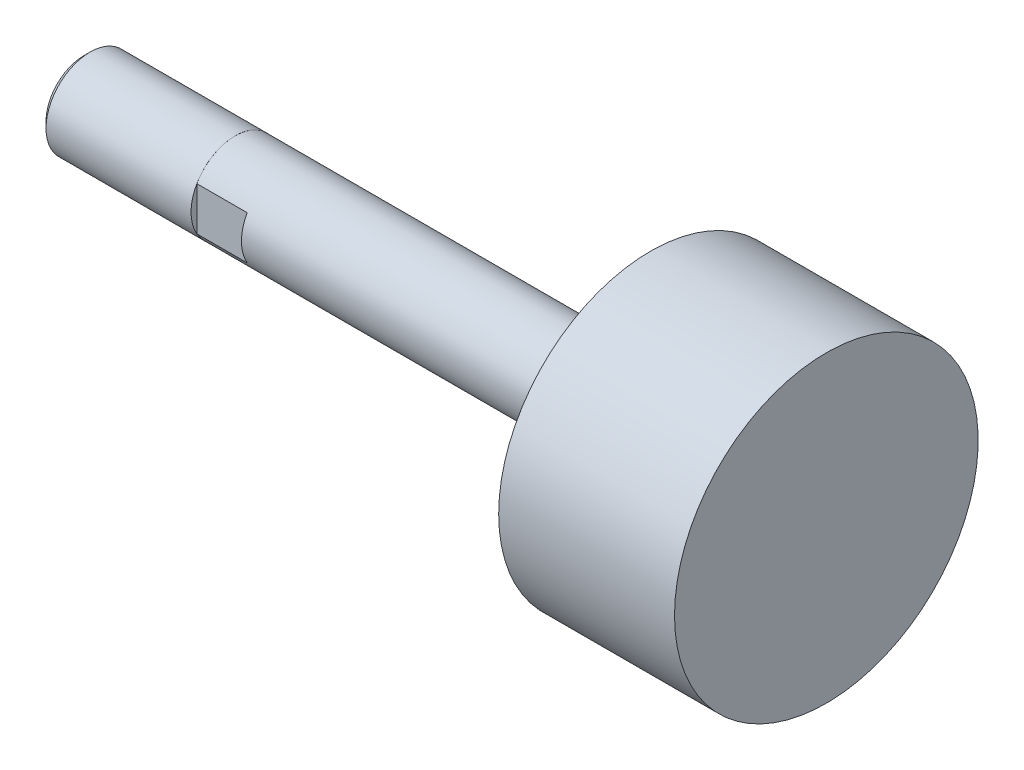
ISO-10303-21;
HEADER;
FILE_DESCRIPTION(('STEP AP214'),'2;1');
FILE_NAME('part.step','',(''),(''),'','','');
FILE_SCHEMA(('AUTOMOTIVE_DESIGN { 1 0 10303 214 1 1 1 1 }'));
ENDSEC;
DATA;
#1=APPLICATION_CONTEXT('core data for automotive mechanical design processes');
#2=APPLICATION_PROTOCOL_DEFINITION('international standard','automotive_design',2000,#1);
#3=PRODUCT_CONTEXT('',#1,'mechanical');
#4=PRODUCT('Part','Part','',(#3));
#5=PRODUCT_RELATED_PRODUCT_CATEGORY('part','',(#4));
#6=PRODUCT_DEFINITION_FORMATION('','',#4);
#7=PRODUCT_DEFINITION_CONTEXT('part definition',#1,'design');
#8=PRODUCT_DEFINITION('design','',#6,#7);
#9=PRODUCT_DEFINITION_SHAPE('','',#8);
#10=(LENGTH_UNIT() NAMED_UNIT(*) SI_UNIT(.MILLI.,.METRE.));
#11=(NAMED_UNIT(*) PLANE_ANGLE_UNIT() SI_UNIT($,.RADIAN.));
#12=(NAMED_UNIT(*) SI_UNIT($,.STERADIAN.) SOLID_ANGLE_UNIT());
#13=UNCERTAINTY_MEASURE_WITH_UNIT(LENGTH_MEASURE(1.E-05),#10,'distance_accuracy_value','');
#14=(GEOMETRIC_REPRESENTATION_CONTEXT(3) GLOBAL_UNCERTAINTY_ASSIGNED_CONTEXT((#13)) GLOBAL_UNIT_ASSIGNED_CONTEXT((#10,
#11,#12)) REPRESENTATION_CONTEXT('',''));
#15=CARTESIAN_POINT('',(0.,0.,0.));
#16=DIRECTION('',(0.,0.,1.));
#17=DIRECTION('',(1.,0.,0.));
#18=AXIS2_PLACEMENT_3D('',#15,#16,#17);
#19=CARTESIAN_POINT('',(-25.4,0.,0.));
#20=DIRECTION('',(1.,0.,0.));
#21=DIRECTION('',(0.,0.,-1.));
#22=AXIS2_PLACEMENT_3D('',#19,#20,#21);
#23=PLANE('',#22);
#24=CARTESIAN_POINT('',(-25.3999999999905,0.,0.));
#25=DIRECTION('',(1.,0.,0.));
#26=DIRECTION('',(0.,0.,-1.));
#27=AXIS2_PLACEMENT_3D('',#24,#25,#26);
#28=CIRCLE('',#27,4.80060000006688);
#29=CARTESIAN_POINT('',(-25.3999999999905,0.,-4.80060000006688));
#30=VERTEX_POINT('',#29);
#31=EDGE_CURVE('E20',#30,#30,#28,.T.);
#32=ORIENTED_EDGE('',*,*,#31,.F.);
#33=EDGE_LOOP('',(#32));
#34=FACE_BOUND('',#33,.T.);
#35=ADVANCED_FACE('F17',(#34),#23,.F.);
#36=CARTESIAN_POINT('',(-24.6443500000169,0.,0.));
#37=DIRECTION('',(1.,0.,0.));
#38=DIRECTION('',(0.,0.,-1.));
#39=AXIS2_PLACEMENT_3D('',#36,#37,#38);
#40=CONICAL_SURFACE('',#39,5.55625000004056,0.785398163397448);
#41=ORIENTED_EDGE('',*,*,#31,.T.);
#42=EDGE_LOOP('',(#41));
#43=FACE_BOUND('',#42,.T.);
#44=CARTESIAN_POINT('',(-24.64435,0.,0.));
#45=DIRECTION('',(-1.,0.,0.));
#46=DIRECTION('',(0.,0.,1.));
#47=AXIS2_PLACEMENT_3D('',#44,#45,#46);
#48=CIRCLE('',#47,5.55625);
#49=CARTESIAN_POINT('',(-24.64435,0.,5.55625));
#50=VERTEX_POINT('',#49);
#51=EDGE_CURVE('E95',#50,#50,#48,.F.);
#52=ORIENTED_EDGE('',*,*,#51,.F.);
#53=EDGE_LOOP('',(#52));
#54=FACE_BOUND('',#53,.T.);
#55=ADVANCED_FACE('F207',(#43,#54),#40,.T.);
#56=CARTESIAN_POINT('',(-6.35,0.,0.));
#57=DIRECTION('',(-1.,0.,0.));
#58=DIRECTION('',(0.,0.,1.));
#59=AXIS2_PLACEMENT_3D('',#56,#57,#58);
#60=CYLINDRICAL_SURFACE('',#59,5.55625);
#61=ORIENTED_EDGE('',*,*,#51,.T.);
#62=EDGE_LOOP('',(#61));
#63=FACE_BOUND('',#62,.T.);
#64=CARTESIAN_POINT('',(-6.35,0.,0.));
#65=DIRECTION('',(-1.,0.,0.));
#66=DIRECTION('',(0.,0.,1.));
#67=AXIS2_PLACEMENT_3D('',#64,#65,#66);
#68=CIRCLE('',#67,5.55625);
#69=CARTESIAN_POINT('',(-6.35,0.,5.55625));
#70=VERTEX_POINT('',#69);
#71=EDGE_CURVE('E65',#70,#70,#68,.T.);
#72=ORIENTED_EDGE('',*,*,#71,.T.);
#73=EDGE_LOOP('',(#72));
#74=FACE_BOUND('',#73,.T.);
#75=ADVANCED_FACE('F198',(#63,#74),#60,.T.);
#76=CARTESIAN_POINT('',(0.,0.,0.));
#77=DIRECTION('',(1.,0.,0.));
#78=DIRECTION('',(0.,0.,-1.));
#79=AXIS2_PLACEMENT_3D('',#76,#77,#78);
#80=PLANE('',#79);
#81=CARTESIAN_POINT('',(0.,0.,0.));
#82=DIRECTION('',(-1.,0.,0.));
#83=DIRECTION('',(0.,0.,1.));
#84=AXIS2_PLACEMENT_3D('',#81,#82,#83);
#85=CIRCLE('',#84,5.5499);
#86=CARTESIAN_POINT('',(0.,2.74064116768321,4.826));
#87=VERTEX_POINT('',#86);
#88=CARTESIAN_POINT('',(0.,-2.74064116768321,4.826));
#89=VERTEX_POINT('',#88);
#90=EDGE_CURVE('E74',#87,#89,#85,.F.);
#91=ORIENTED_EDGE('',*,*,#90,.F.);
#92=DIRECTION('',(0.,1.,0.));
#93=VECTOR('',#92,1.);
#94=CARTESIAN_POINT('',(0.,5.5499,4.826));
#95=LINE('',#94,#93);
#96=EDGE_CURVE('E66',#87,#89,#95,.F.);
#97=ORIENTED_EDGE('',*,*,#96,.T.);
#98=EDGE_LOOP('',(#91,#97));
#99=FACE_BOUND('',#98,.T.);
#100=ADVANCED_FACE('F190',(#99),#80,.F.);
#101=CARTESIAN_POINT('',(0.,5.5499,4.826));
#102=DIRECTION('',(0.,0.,-1.));
#103=DIRECTION('',(-1.,0.,0.));
#104=AXIS2_PLACEMENT_3D('',#101,#102,#103);
#105=PLANE('',#104);
#106=DIRECTION('',(-1.,0.,0.));
#107=VECTOR('',#106,1.);
#108=CARTESIAN_POINT('',(68.199,-2.74064116768321,4.826));
#109=LINE('',#108,#107);
#110=CARTESIAN_POINT('',(-6.35,-2.74064116768321,4.826));
#111=VERTEX_POINT('',#110);
#112=EDGE_CURVE('E93',#89,#111,#109,.T.);
#113=ORIENTED_EDGE('',*,*,#112,.F.);
#114=ORIENTED_EDGE('',*,*,#96,.F.);
#115=DIRECTION('',(-1.,0.,0.));
#116=VECTOR('',#115,1.);
#117=CARTESIAN_POINT('',(68.199,2.74064116768321,4.826));
#118=LINE('',#117,#116);
#119=CARTESIAN_POINT('',(-6.35,2.74064116768321,4.826));
#120=VERTEX_POINT('',#119);
#121=EDGE_CURVE('E69',#120,#87,#118,.F.);
#122=ORIENTED_EDGE('',*,*,#121,.F.);
#123=DIRECTION('',(0.,1.,0.));
#124=VECTOR('',#123,1.);
#125=CARTESIAN_POINT('',(-6.35,5.55625,4.826));
#126=LINE('',#125,#124);
#127=EDGE_CURVE('E57',#120,#111,#126,.F.);
#128=ORIENTED_EDGE('',*,*,#127,.T.);
#129=EDGE_LOOP('',(#113,#114,#122,#128));
#130=FACE_BOUND('',#129,.T.);
#131=ADVANCED_FACE('F70',(#130),#105,.F.);
#132=CARTESIAN_POINT('',(-6.35,5.55625,0.));
#133=DIRECTION('',(-1.,0.,0.));
#134=DIRECTION('',(0.,0.,1.));
#135=AXIS2_PLACEMENT_3D('',#132,#133,#134);
#136=PLANE('',#135);
#137=ORIENTED_EDGE('',*,*,#71,.F.);
#138=EDGE_LOOP('',(#137));
#139=FACE_BOUND('',#138,.T.);
#140=DIRECTION('',(0.,1.,0.));
#141=VECTOR('',#140,1.);
#142=CARTESIAN_POINT('',(-6.35,-5.5499,-4.826));
#143=LINE('',#142,#141);
#144=CARTESIAN_POINT('',(-6.35,2.74064116768321,-4.826));
#145=VERTEX_POINT('',#144);
#146=CARTESIAN_POINT('',(-6.34999999999999,-2.74064116768321,-4.826));
#147=VERTEX_POINT('',#146);
#148=EDGE_CURVE('E81',#145,#147,#143,.F.);
#149=ORIENTED_EDGE('',*,*,#148,.T.);
#150=CARTESIAN_POINT('',(-6.34999999999999,0.,0.));
#151=DIRECTION('',(-1.,0.,0.));
#152=DIRECTION('',(0.,0.,1.));
#153=AXIS2_PLACEMENT_3D('',#150,#151,#152);
#154=CIRCLE('',#153,5.5499);
#155=EDGE_CURVE('E61',#111,#147,#154,.F.);
#156=ORIENTED_EDGE('',*,*,#155,.F.);
#157=ORIENTED_EDGE('',*,*,#127,.F.);
#158=CARTESIAN_POINT('',(-6.34999999999999,0.,0.));
#159=DIRECTION('',(-1.,0.,0.));
#160=DIRECTION('',(0.,0.,1.));
#161=AXIS2_PLACEMENT_3D('',#158,#159,#160);
#162=CIRCLE('',#161,5.5499);
#163=EDGE_CURVE('E54',#145,#120,#162,.F.);
#164=ORIENTED_EDGE('',*,*,#163,.F.);
#165=EDGE_LOOP('',(#149,#156,#157,#164));
#166=FACE_BOUND('',#165,.T.);
#167=ADVANCED_FACE('F59',(#139,#166),#136,.F.);
#168=CARTESIAN_POINT('',(0.,0.,0.));
#169=DIRECTION('',(1.,0.,0.));
#170=DIRECTION('',(0.,0.,-1.));
#171=AXIS2_PLACEMENT_3D('',#168,#169,#170);
#172=PLANE('',#171);
#173=CARTESIAN_POINT('',(0.,0.,0.));
#174=DIRECTION('',(-1.,0.,0.));
#175=DIRECTION('',(0.,0.,1.));
#176=AXIS2_PLACEMENT_3D('',#173,#174,#175);
#177=CIRCLE('',#176,5.5499);
#178=CARTESIAN_POINT('',(0.,-2.74064116768321,-4.826));
#179=VERTEX_POINT('',#178);
#180=CARTESIAN_POINT('',(0.,2.74064116768321,-4.826));
#181=VERTEX_POINT('',#180);
#182=EDGE_CURVE('E106',#179,#181,#177,.F.);
#183=ORIENTED_EDGE('',*,*,#182,.F.);
#184=DIRECTION('',(0.,1.,0.));
#185=VECTOR('',#184,1.);
#186=CARTESIAN_POINT('',(0.,-5.5499,-4.826));
#187=LINE('',#186,#185);
#188=EDGE_CURVE('E34',#179,#181,#187,.T.);
#189=ORIENTED_EDGE('',*,*,#188,.T.);
#190=EDGE_LOOP('',(#183,#189));
#191=FACE_BOUND('',#190,.T.);
#192=ADVANCED_FACE('F112',(#191),#172,.F.);
#193=CARTESIAN_POINT('',(0.,-5.5499,-4.826));
#194=DIRECTION('',(0.,0.,1.));
#195=DIRECTION('',(1.,0.,0.));
#196=AXIS2_PLACEMENT_3D('',#193,#194,#195);
#197=PLANE('',#196);
#198=DIRECTION('',(-1.,0.,0.));
#199=VECTOR('',#198,1.);
#200=CARTESIAN_POINT('',(68.199,2.74064116768321,-4.826));
#201=LINE('',#200,#199);
#202=EDGE_CURVE('E80',#181,#145,#201,.T.);
#203=ORIENTED_EDGE('',*,*,#202,.F.);
#204=ORIENTED_EDGE('',*,*,#188,.F.);
#205=DIRECTION('',(-1.,0.,0.));
#206=VECTOR('',#205,1.);
#207=CARTESIAN_POINT('',(68.199,-2.74064116768321,-4.826));
#208=LINE('',#207,#206);
#209=EDGE_CURVE('E107',#147,#179,#208,.F.);
#210=ORIENTED_EDGE('',*,*,#209,.F.);
#211=ORIENTED_EDGE('',*,*,#148,.F.);
#212=EDGE_LOOP('',(#203,#204,#210,#211));
#213=FACE_BOUND('',#212,.T.);
#214=ADVANCED_FACE('F111',(#213),#197,.F.);
#215=CARTESIAN_POINT('',(68.199,0.,0.));
#216=DIRECTION('',(-1.,0.,0.));
#217=DIRECTION('',(0.,0.,1.));
#218=AXIS2_PLACEMENT_3D('',#215,#216,#217);
#219=CYLINDRICAL_SURFACE('',#218,5.5499);
#220=ORIENTED_EDGE('',*,*,#182,.T.);
#221=ORIENTED_EDGE('',*,*,#202,.T.);
#222=ORIENTED_EDGE('',*,*,#163,.T.);
#223=ORIENTED_EDGE('',*,*,#121,.T.);
#224=ORIENTED_EDGE('',*,*,#90,.T.);
#225=ORIENTED_EDGE('',*,*,#112,.T.);
#226=ORIENTED_EDGE('',*,*,#155,.T.);
#227=ORIENTED_EDGE('',*,*,#209,.T.);
#228=EDGE_LOOP('',(#220,#221,#222,#223,#224,#225,#226,#227));
#229=FACE_BOUND('',#228,.T.);
#230=CARTESIAN_POINT('',(46.0248,0.,0.));
#231=DIRECTION('',(-1.,0.,0.));
#232=DIRECTION('',(0.,0.,1.));
#233=AXIS2_PLACEMENT_3D('',#230,#231,#232);
#234=CIRCLE('',#233,5.5499);
#235=CARTESIAN_POINT('',(46.0248,0.,5.5499));
#236=VERTEX_POINT('',#235);
#237=EDGE_CURVE('E103',#236,#236,#234,.T.);
#238=ORIENTED_EDGE('',*,*,#237,.T.);
#239=EDGE_LOOP('',(#238));
#240=FACE_BOUND('',#239,.T.);
#241=ADVANCED_FACE('F78',(#229,#240),#219,.T.);
#242=CARTESIAN_POINT('',(68.199,19.14525,0.));
#243=DIRECTION('',(-1.,0.,0.));
#244=DIRECTION('',(0.,0.,1.));
#245=AXIS2_PLACEMENT_3D('',#242,#243,#244);
#246=PLANE('',#245);
#247=CARTESIAN_POINT('',(68.199,0.,0.));
#248=DIRECTION('',(-1.,0.,0.));
#249=DIRECTION('',(0.,0.,1.));
#250=AXIS2_PLACEMENT_3D('',#247,#248,#249);
#251=CIRCLE('',#250,19.14525);
#252=CARTESIAN_POINT('',(68.199,0.,19.14525));
#253=VERTEX_POINT('',#252);
#254=EDGE_CURVE('E26',#253,#253,#251,.T.);
#255=ORIENTED_EDGE('',*,*,#254,.F.);
#256=EDGE_LOOP('',(#255));
#257=FACE_BOUND('',#256,.T.);
#258=ADVANCED_FACE('F131',(#257),#246,.F.);
#259=CARTESIAN_POINT('',(46.0248,5.5499,0.));
#260=DIRECTION('',(1.,0.,0.));
#261=DIRECTION('',(0.,0.,-1.));
#262=AXIS2_PLACEMENT_3D('',#259,#260,#261);
#263=PLANE('',#262);
#264=ORIENTED_EDGE('',*,*,#237,.F.);
#265=EDGE_LOOP('',(#264));
#266=FACE_BOUND('',#265,.T.);
#267=CARTESIAN_POINT('',(46.0248,0.,0.));
#268=DIRECTION('',(-1.,0.,0.));
#269=DIRECTION('',(0.,0.,1.));
#270=AXIS2_PLACEMENT_3D('',#267,#268,#269);
#271=CIRCLE('',#270,19.14525);
#272=CARTESIAN_POINT('',(46.0248,0.,19.14525));
#273=VERTEX_POINT('',#272);
#274=EDGE_CURVE('E11',#273,#273,#271,.F.);
#275=ORIENTED_EDGE('',*,*,#274,.F.);
#276=EDGE_LOOP('',(#275));
#277=FACE_BOUND('',#276,.T.);
#278=ADVANCED_FACE('F125',(#266,#277),#263,.F.);
#279=CARTESIAN_POINT('',(68.199,0.,0.));
#280=DIRECTION('',(-1.,0.,0.));
#281=DIRECTION('',(0.,0.,1.));
#282=AXIS2_PLACEMENT_3D('',#279,#280,#281);
#283=CYLINDRICAL_SURFACE('',#282,19.14525);
#284=ORIENTED_EDGE('',*,*,#274,.T.);
#285=EDGE_LOOP('',(#284));
#286=FACE_BOUND('',#285,.T.);
#287=ORIENTED_EDGE('',*,*,#254,.T.);
#288=EDGE_LOOP('',(#287));
#289=FACE_BOUND('',#288,.T.);
#290=ADVANCED_FACE('F123',(#286,#289),#283,.T.);
#291=CLOSED_SHELL('',(#35,#55,#75,#100,#131,#167,#192,#214,#241,#258,#278,#290));
#292=MANIFOLD_SOLID_BREP('B1',#291);
#293=ADVANCED_BREP_SHAPE_REPRESENTATION('',(#18,#292),#14);
#294=SHAPE_DEFINITION_REPRESENTATION(#9,#293);
ENDSEC;
END-ISO-10303-21;
